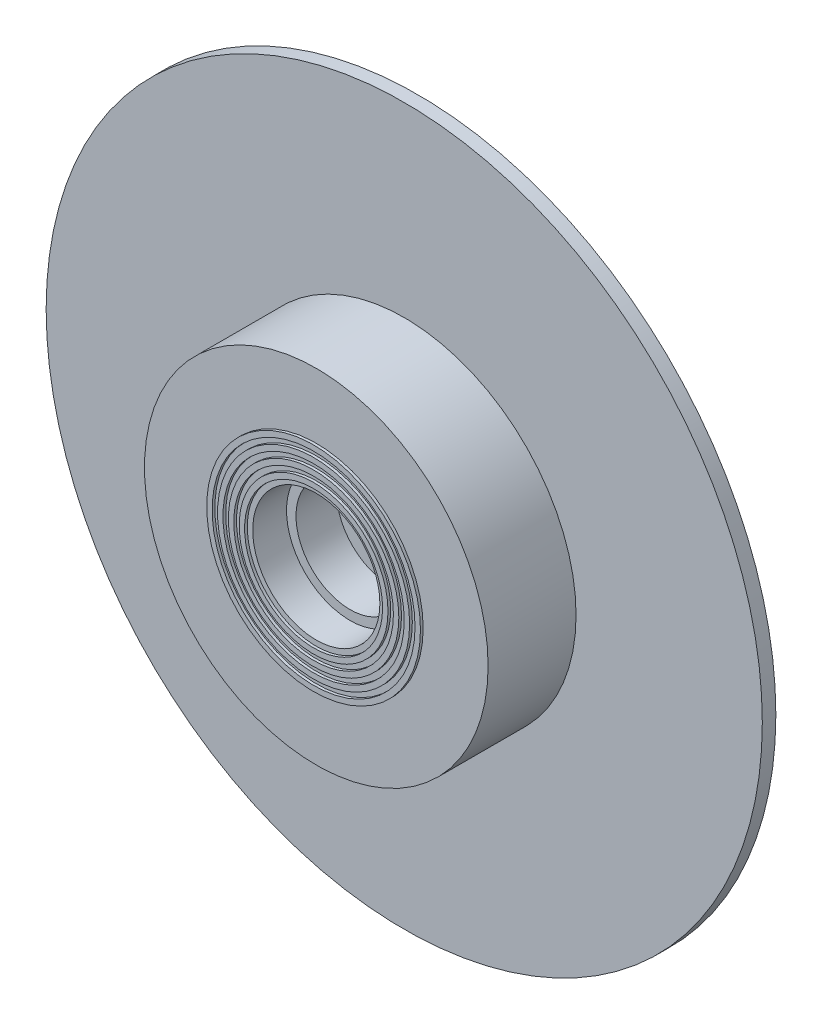
ISO-10303-21;
HEADER;
FILE_DESCRIPTION(('STEP AP214'),'2;1');
FILE_NAME('part.step','',(''),(''),'','','');
FILE_SCHEMA(('AUTOMOTIVE_DESIGN { 1 0 10303 214 1 1 1 1 }'));
ENDSEC;
DATA;
#1=APPLICATION_CONTEXT('core data for automotive mechanical design processes');
#2=APPLICATION_PROTOCOL_DEFINITION('international standard','automotive_design',2000,#1);
#3=PRODUCT_CONTEXT('',#1,'mechanical');
#4=PRODUCT('Part','Part','',(#3));
#5=PRODUCT_RELATED_PRODUCT_CATEGORY('part','',(#4));
#6=PRODUCT_DEFINITION_FORMATION('','',#4);
#7=PRODUCT_DEFINITION_CONTEXT('part definition',#1,'design');
#8=PRODUCT_DEFINITION('design','',#6,#7);
#9=PRODUCT_DEFINITION_SHAPE('','',#8);
#10=(LENGTH_UNIT() NAMED_UNIT(*) SI_UNIT(.MILLI.,.METRE.));
#11=(NAMED_UNIT(*) PLANE_ANGLE_UNIT() SI_UNIT($,.RADIAN.));
#12=(NAMED_UNIT(*) SI_UNIT($,.STERADIAN.) SOLID_ANGLE_UNIT());
#13=UNCERTAINTY_MEASURE_WITH_UNIT(LENGTH_MEASURE(1.E-05),#10,'distance_accuracy_value','');
#14=(GEOMETRIC_REPRESENTATION_CONTEXT(3) GLOBAL_UNCERTAINTY_ASSIGNED_CONTEXT((#13)) GLOBAL_UNIT_ASSIGNED_CONTEXT((#10,
#11,#12)) REPRESENTATION_CONTEXT('',''));
#15=CARTESIAN_POINT('',(0.,0.,0.));
#16=DIRECTION('',(0.,0.,1.));
#17=DIRECTION('',(1.,0.,0.));
#18=AXIS2_PLACEMENT_3D('',#15,#16,#17);
#19=CARTESIAN_POINT('',(0.,0.,1538.3488944663));
#20=DIRECTION('',(0.,0.,1.));
#21=DIRECTION('',(1.,0.,0.));
#22=AXIS2_PLACEMENT_3D('',#19,#20,#21);
#23=CYLINDRICAL_SURFACE('',#22,28.5);
#24=CARTESIAN_POINT('',(0.,0.,4.99999999999989));
#25=DIRECTION('',(0.,0.,1.));
#26=DIRECTION('',(1.,0.,0.));
#27=AXIS2_PLACEMENT_3D('',#24,#25,#26);
#28=CIRCLE('',#27,28.5);
#29=CARTESIAN_POINT('',(28.5,0.,4.99999999999989));
#30=VERTEX_POINT('',#29);
#31=EDGE_CURVE('E10',#30,#30,#28,.T.);
#32=ORIENTED_EDGE('',*,*,#31,.T.);
#33=EDGE_LOOP('',(#32));
#34=FACE_BOUND('',#33,.T.);
#35=CARTESIAN_POINT('',(0.,0.,32.5));
#36=DIRECTION('',(0.,0.,1.));
#37=DIRECTION('',(1.,0.,0.));
#38=AXIS2_PLACEMENT_3D('',#35,#36,#37);
#39=CIRCLE('',#38,28.5);
#40=CARTESIAN_POINT('',(28.5,0.,32.5));
#41=VERTEX_POINT('',#40);
#42=EDGE_CURVE('E134',#41,#41,#39,.T.);
#43=ORIENTED_EDGE('',*,*,#42,.F.);
#44=EDGE_LOOP('',(#43));
#45=FACE_BOUND('',#44,.T.);
#46=ADVANCED_FACE('F40',(#34,#45),#23,.T.);
#47=CARTESIAN_POINT('',(0.,0.,5.));
#48=DIRECTION('',(0.,0.,-1.));
#49=DIRECTION('',(-1.,0.,0.));
#50=AXIS2_PLACEMENT_3D('',#47,#48,#49);
#51=PLANE('',#50);
#52=CARTESIAN_POINT('',(0.,0.,4.99999999999989));
#53=DIRECTION('',(0.,0.,1.));
#54=DIRECTION('',(1.,0.,0.));
#55=AXIS2_PLACEMENT_3D('',#52,#53,#54);
#56=CIRCLE('',#55,12.1);
#57=CARTESIAN_POINT('',(12.1,0.,4.99999999999989));
#58=VERTEX_POINT('',#57);
#59=EDGE_CURVE('E43',#58,#58,#56,.T.);
#60=ORIENTED_EDGE('',*,*,#59,.T.);
#61=EDGE_LOOP('',(#60));
#62=FACE_BOUND('',#61,.T.);
#63=ORIENTED_EDGE('',*,*,#31,.F.);
#64=EDGE_LOOP('',(#63));
#65=FACE_BOUND('',#64,.T.);
#66=ADVANCED_FACE('F138',(#62,#65),#51,.T.);
#67=CARTESIAN_POINT('',(0.,0.,1538.3488944663));
#68=DIRECTION('',(0.,0.,1.));
#69=DIRECTION('',(1.,0.,0.));
#70=AXIS2_PLACEMENT_3D('',#67,#68,#69);
#71=CYLINDRICAL_SURFACE('',#70,12.1);
#72=CARTESIAN_POINT('',(0.,0.,10.));
#73=DIRECTION('',(0.,0.,1.));
#74=DIRECTION('',(1.,0.,0.));
#75=AXIS2_PLACEMENT_3D('',#72,#73,#74);
#76=CIRCLE('',#75,12.1);
#77=CARTESIAN_POINT('',(12.1,0.,10.));
#78=VERTEX_POINT('',#77);
#79=EDGE_CURVE('E50',#78,#78,#76,.T.);
#80=ORIENTED_EDGE('',*,*,#79,.T.);
#81=EDGE_LOOP('',(#80));
#82=FACE_BOUND('',#81,.T.);
#83=ORIENTED_EDGE('',*,*,#59,.F.);
#84=EDGE_LOOP('',(#83));
#85=FACE_BOUND('',#84,.T.);
#86=ADVANCED_FACE('F141',(#82,#85),#71,.F.);
#87=CARTESIAN_POINT('',(0.,0.,10.));
#88=DIRECTION('',(0.,0.,1.));
#89=DIRECTION('',(1.,0.,0.));
#90=AXIS2_PLACEMENT_3D('',#87,#88,#89);
#91=PLANE('',#90);
#92=CARTESIAN_POINT('',(0.,0.,10.));
#93=DIRECTION('',(0.,0.,1.));
#94=DIRECTION('',(1.,0.,0.));
#95=AXIS2_PLACEMENT_3D('',#92,#93,#94);
#96=CIRCLE('',#95,20.);
#97=CARTESIAN_POINT('',(20.,0.,10.));
#98=VERTEX_POINT('',#97);
#99=EDGE_CURVE('E51',#98,#98,#96,.T.);
#100=ORIENTED_EDGE('',*,*,#99,.T.);
#101=EDGE_LOOP('',(#100));
#102=FACE_BOUND('',#101,.T.);
#103=ORIENTED_EDGE('',*,*,#79,.F.);
#104=EDGE_LOOP('',(#103));
#105=FACE_BOUND('',#104,.T.);
#106=ADVANCED_FACE('F150',(#102,#105),#91,.T.);
#107=CARTESIAN_POINT('',(0.,0.,1538.3488944663));
#108=DIRECTION('',(0.,0.,1.));
#109=DIRECTION('',(1.,0.,0.));
#110=AXIS2_PLACEMENT_3D('',#107,#108,#109);
#111=CYLINDRICAL_SURFACE('',#110,20.);
#112=CARTESIAN_POINT('',(0.,0.,24.9999999999999));
#113=DIRECTION('',(0.,0.,1.));
#114=DIRECTION('',(1.,0.,0.));
#115=AXIS2_PLACEMENT_3D('',#112,#113,#114);
#116=CIRCLE('',#115,20.);
#117=CARTESIAN_POINT('',(20.,0.,24.9999999999999));
#118=VERTEX_POINT('',#117);
#119=EDGE_CURVE('E57',#118,#118,#116,.T.);
#120=ORIENTED_EDGE('',*,*,#119,.T.);
#121=EDGE_LOOP('',(#120));
#122=FACE_BOUND('',#121,.T.);
#123=ORIENTED_EDGE('',*,*,#99,.F.);
#124=EDGE_LOOP('',(#123));
#125=FACE_BOUND('',#124,.T.);
#126=ADVANCED_FACE('F152',(#122,#125),#111,.F.);
#127=CARTESIAN_POINT('',(0.,0.,25.));
#128=DIRECTION('',(0.,0.,1.));
#129=DIRECTION('',(1.,0.,0.));
#130=AXIS2_PLACEMENT_3D('',#127,#128,#129);
#131=PLANE('',#130);
#132=CARTESIAN_POINT('',(0.,0.,24.9999999999999));
#133=DIRECTION('',(0.,0.,1.));
#134=DIRECTION('',(1.,0.,0.));
#135=AXIS2_PLACEMENT_3D('',#132,#133,#134);
#136=CIRCLE('',#135,23.5);
#137=CARTESIAN_POINT('',(23.5,0.,24.9999999999999));
#138=VERTEX_POINT('',#137);
#139=EDGE_CURVE('E56',#138,#138,#136,.T.);
#140=ORIENTED_EDGE('',*,*,#139,.T.);
#141=EDGE_LOOP('',(#140));
#142=FACE_BOUND('',#141,.T.);
#143=ORIENTED_EDGE('',*,*,#119,.F.);
#144=EDGE_LOOP('',(#143));
#145=FACE_BOUND('',#144,.T.);
#146=ADVANCED_FACE('F158',(#142,#145),#131,.T.);
#147=CARTESIAN_POINT('',(0.,0.,1538.3488944663));
#148=DIRECTION('',(0.,0.,1.));
#149=DIRECTION('',(1.,0.,0.));
#150=AXIS2_PLACEMENT_3D('',#147,#148,#149);
#151=CYLINDRICAL_SURFACE('',#150,23.5);
#152=CARTESIAN_POINT('',(0.,0.,37.5000000000001));
#153=DIRECTION('',(0.,0.,1.));
#154=DIRECTION('',(1.,0.,0.));
#155=AXIS2_PLACEMENT_3D('',#152,#153,#154);
#156=CIRCLE('',#155,23.5);
#157=CARTESIAN_POINT('',(23.5,0.,37.5000000000001));
#158=VERTEX_POINT('',#157);
#159=EDGE_CURVE('E61',#158,#158,#156,.T.);
#160=ORIENTED_EDGE('',*,*,#159,.T.);
#161=EDGE_LOOP('',(#160));
#162=FACE_BOUND('',#161,.T.);
#163=ORIENTED_EDGE('',*,*,#139,.F.);
#164=EDGE_LOOP('',(#163));
#165=FACE_BOUND('',#164,.T.);
#166=ADVANCED_FACE('F165',(#162,#165),#151,.F.);
#167=CARTESIAN_POINT('',(0.,0.,37.5));
#168=DIRECTION('',(0.,0.,1.));
#169=DIRECTION('',(1.,0.,0.));
#170=AXIS2_PLACEMENT_3D('',#167,#168,#169);
#171=PLANE('',#170);
#172=CARTESIAN_POINT('',(0.,0.,37.5000000000001));
#173=DIRECTION('',(0.,0.,1.));
#174=DIRECTION('',(1.,0.,0.));
#175=AXIS2_PLACEMENT_3D('',#172,#173,#174);
#176=CIRCLE('',#175,25.5);
#177=CARTESIAN_POINT('',(25.5,0.,37.5000000000001));
#178=VERTEX_POINT('',#177);
#179=EDGE_CURVE('E62',#178,#178,#176,.T.);
#180=ORIENTED_EDGE('',*,*,#179,.T.);
#181=EDGE_LOOP('',(#180));
#182=FACE_BOUND('',#181,.T.);
#183=ORIENTED_EDGE('',*,*,#159,.F.);
#184=EDGE_LOOP('',(#183));
#185=FACE_BOUND('',#184,.T.);
#186=ADVANCED_FACE('F167',(#182,#185),#171,.T.);
#187=CARTESIAN_POINT('',(0.,0.,1538.3488944663));
#188=DIRECTION('',(0.,0.,1.));
#189=DIRECTION('',(1.,0.,0.));
#190=AXIS2_PLACEMENT_3D('',#187,#188,#189);
#191=CYLINDRICAL_SURFACE('',#190,25.5);
#192=CARTESIAN_POINT('',(0.,0.,38.5));
#193=DIRECTION('',(0.,0.,1.));
#194=DIRECTION('',(1.,0.,0.));
#195=AXIS2_PLACEMENT_3D('',#192,#193,#194);
#196=CIRCLE('',#195,25.5);
#197=CARTESIAN_POINT('',(25.5,0.,38.5));
#198=VERTEX_POINT('',#197);
#199=EDGE_CURVE('E70',#198,#198,#196,.T.);
#200=ORIENTED_EDGE('',*,*,#199,.T.);
#201=EDGE_LOOP('',(#200));
#202=FACE_BOUND('',#201,.T.);
#203=ORIENTED_EDGE('',*,*,#179,.F.);
#204=EDGE_LOOP('',(#203));
#205=FACE_BOUND('',#204,.T.);
#206=ADVANCED_FACE('F168',(#202,#205),#191,.F.);
#207=CARTESIAN_POINT('',(0.,1.33573707650214E-13,38.5));
#208=DIRECTION('',(0.,0.,1.));
#209=DIRECTION('',(1.,0.,0.));
#210=AXIS2_PLACEMENT_3D('',#207,#208,#209);
#211=PLANE('',#210);
#212=CARTESIAN_POINT('',(0.,0.,38.5));
#213=DIRECTION('',(0.,0.,1.));
#214=DIRECTION('',(1.,0.,0.));
#215=AXIS2_PLACEMENT_3D('',#212,#213,#214);
#216=CIRCLE('',#215,27.5);
#217=CARTESIAN_POINT('',(27.5,0.,38.5));
#218=VERTEX_POINT('',#217);
#219=EDGE_CURVE('E72',#218,#218,#216,.T.);
#220=ORIENTED_EDGE('',*,*,#219,.T.);
#221=EDGE_LOOP('',(#220));
#222=FACE_BOUND('',#221,.T.);
#223=ORIENTED_EDGE('',*,*,#199,.F.);
#224=EDGE_LOOP('',(#223));
#225=FACE_BOUND('',#224,.T.);
#226=ADVANCED_FACE('F173',(#222,#225),#211,.T.);
#227=CARTESIAN_POINT('',(0.,0.,1538.3488944663));
#228=DIRECTION('',(0.,0.,1.));
#229=DIRECTION('',(1.,0.,0.));
#230=AXIS2_PLACEMENT_3D('',#227,#228,#229);
#231=CYLINDRICAL_SURFACE('',#230,27.5);
#232=CARTESIAN_POINT('',(0.,0.,37.5000000000001));
#233=DIRECTION('',(0.,0.,1.));
#234=DIRECTION('',(1.,0.,0.));
#235=AXIS2_PLACEMENT_3D('',#232,#233,#234);
#236=CIRCLE('',#235,27.5);
#237=CARTESIAN_POINT('',(27.5,0.,37.5000000000001));
#238=VERTEX_POINT('',#237);
#239=EDGE_CURVE('E74',#238,#238,#236,.T.);
#240=ORIENTED_EDGE('',*,*,#239,.T.);
#241=EDGE_LOOP('',(#240));
#242=FACE_BOUND('',#241,.T.);
#243=ORIENTED_EDGE('',*,*,#219,.F.);
#244=EDGE_LOOP('',(#243));
#245=FACE_BOUND('',#244,.T.);
#246=ADVANCED_FACE('F180',(#242,#245),#231,.T.);
#247=CARTESIAN_POINT('',(0.,0.,37.5));
#248=DIRECTION('',(0.,0.,1.));
#249=DIRECTION('',(1.,0.,0.));
#250=AXIS2_PLACEMENT_3D('',#247,#248,#249);
#251=PLANE('',#250);
#252=CARTESIAN_POINT('',(0.,0.,37.5000000000001));
#253=DIRECTION('',(0.,0.,1.));
#254=DIRECTION('',(1.,0.,0.));
#255=AXIS2_PLACEMENT_3D('',#252,#253,#254);
#256=CIRCLE('',#255,29.5);
#257=CARTESIAN_POINT('',(29.5,0.,37.5000000000001));
#258=VERTEX_POINT('',#257);
#259=EDGE_CURVE('E76',#258,#258,#256,.T.);
#260=ORIENTED_EDGE('',*,*,#259,.T.);
#261=EDGE_LOOP('',(#260));
#262=FACE_BOUND('',#261,.T.);
#263=ORIENTED_EDGE('',*,*,#239,.F.);
#264=EDGE_LOOP('',(#263));
#265=FACE_BOUND('',#264,.T.);
#266=ADVANCED_FACE('F185',(#262,#265),#251,.T.);
#267=CARTESIAN_POINT('',(0.,0.,1538.3488944663));
#268=DIRECTION('',(0.,0.,1.));
#269=DIRECTION('',(1.,0.,0.));
#270=AXIS2_PLACEMENT_3D('',#267,#268,#269);
#271=CYLINDRICAL_SURFACE('',#270,29.5);
#272=CARTESIAN_POINT('',(0.,0.,38.5));
#273=DIRECTION('',(0.,0.,1.));
#274=DIRECTION('',(1.,0.,0.));
#275=AXIS2_PLACEMENT_3D('',#272,#273,#274);
#276=CIRCLE('',#275,29.5);
#277=CARTESIAN_POINT('',(29.5,0.,38.5));
#278=VERTEX_POINT('',#277);
#279=EDGE_CURVE('E77',#278,#278,#276,.T.);
#280=ORIENTED_EDGE('',*,*,#279,.T.);
#281=EDGE_LOOP('',(#280));
#282=FACE_BOUND('',#281,.T.);
#283=ORIENTED_EDGE('',*,*,#259,.F.);
#284=EDGE_LOOP('',(#283));
#285=FACE_BOUND('',#284,.T.);
#286=ADVANCED_FACE('F189',(#282,#285),#271,.F.);
#287=CARTESIAN_POINT('',(0.,1.33573707650214E-13,38.5));
#288=DIRECTION('',(0.,0.,1.));
#289=DIRECTION('',(1.,0.,0.));
#290=AXIS2_PLACEMENT_3D('',#287,#288,#289);
#291=PLANE('',#290);
#292=CARTESIAN_POINT('',(0.,0.,38.5));
#293=DIRECTION('',(0.,0.,1.));
#294=DIRECTION('',(1.,0.,0.));
#295=AXIS2_PLACEMENT_3D('',#292,#293,#294);
#296=CIRCLE('',#295,31.5);
#297=CARTESIAN_POINT('',(31.5,0.,38.5));
#298=VERTEX_POINT('',#297);
#299=EDGE_CURVE('E85',#298,#298,#296,.T.);
#300=ORIENTED_EDGE('',*,*,#299,.T.);
#301=EDGE_LOOP('',(#300));
#302=FACE_BOUND('',#301,.T.);
#303=ORIENTED_EDGE('',*,*,#279,.F.);
#304=EDGE_LOOP('',(#303));
#305=FACE_BOUND('',#304,.T.);
#306=ADVANCED_FACE('F187',(#302,#305),#291,.T.);
#307=CARTESIAN_POINT('',(0.,0.,1538.3488944663));
#308=DIRECTION('',(0.,0.,1.));
#309=DIRECTION('',(1.,0.,0.));
#310=AXIS2_PLACEMENT_3D('',#307,#308,#309);
#311=CYLINDRICAL_SURFACE('',#310,31.5);
#312=CARTESIAN_POINT('',(0.,0.,37.5000000000001));
#313=DIRECTION('',(0.,0.,1.));
#314=DIRECTION('',(1.,0.,0.));
#315=AXIS2_PLACEMENT_3D('',#312,#313,#314);
#316=CIRCLE('',#315,31.5);
#317=CARTESIAN_POINT('',(31.5,0.,37.5000000000001));
#318=VERTEX_POINT('',#317);
#319=EDGE_CURVE('E88',#318,#318,#316,.T.);
#320=ORIENTED_EDGE('',*,*,#319,.T.);
#321=EDGE_LOOP('',(#320));
#322=FACE_BOUND('',#321,.T.);
#323=ORIENTED_EDGE('',*,*,#299,.F.);
#324=EDGE_LOOP('',(#323));
#325=FACE_BOUND('',#324,.T.);
#326=ADVANCED_FACE('F193',(#322,#325),#311,.T.);
#327=CARTESIAN_POINT('',(0.,0.,37.5));
#328=DIRECTION('',(0.,0.,1.));
#329=DIRECTION('',(1.,0.,0.));
#330=AXIS2_PLACEMENT_3D('',#327,#328,#329);
#331=PLANE('',#330);
#332=CARTESIAN_POINT('',(0.,0.,37.5000000000001));
#333=DIRECTION('',(0.,0.,1.));
#334=DIRECTION('',(1.,0.,0.));
#335=AXIS2_PLACEMENT_3D('',#332,#333,#334);
#336=CIRCLE('',#335,33.5);
#337=CARTESIAN_POINT('',(33.5,0.,37.5000000000001));
#338=VERTEX_POINT('',#337);
#339=EDGE_CURVE('E90',#338,#338,#336,.T.);
#340=ORIENTED_EDGE('',*,*,#339,.T.);
#341=EDGE_LOOP('',(#340));
#342=FACE_BOUND('',#341,.T.);
#343=ORIENTED_EDGE('',*,*,#319,.F.);
#344=EDGE_LOOP('',(#343));
#345=FACE_BOUND('',#344,.T.);
#346=ADVANCED_FACE('F196',(#342,#345),#331,.T.);
#347=CARTESIAN_POINT('',(0.,0.,1538.3488944663));
#348=DIRECTION('',(0.,0.,1.));
#349=DIRECTION('',(1.,0.,0.));
#350=AXIS2_PLACEMENT_3D('',#347,#348,#349);
#351=CYLINDRICAL_SURFACE('',#350,33.5);
#352=CARTESIAN_POINT('',(0.,0.,38.5));
#353=DIRECTION('',(0.,0.,1.));
#354=DIRECTION('',(1.,0.,0.));
#355=AXIS2_PLACEMENT_3D('',#352,#353,#354);
#356=CIRCLE('',#355,33.5);
#357=CARTESIAN_POINT('',(33.5,0.,38.5));
#358=VERTEX_POINT('',#357);
#359=EDGE_CURVE('E95',#358,#358,#356,.T.);
#360=ORIENTED_EDGE('',*,*,#359,.T.);
#361=EDGE_LOOP('',(#360));
#362=FACE_BOUND('',#361,.T.);
#363=ORIENTED_EDGE('',*,*,#339,.F.);
#364=EDGE_LOOP('',(#363));
#365=FACE_BOUND('',#364,.T.);
#366=ADVANCED_FACE('F205',(#362,#365),#351,.F.);
#367=CARTESIAN_POINT('',(0.,1.33573707650214E-13,38.5));
#368=DIRECTION('',(0.,0.,1.));
#369=DIRECTION('',(1.,0.,0.));
#370=AXIS2_PLACEMENT_3D('',#367,#368,#369);
#371=PLANE('',#370);
#372=CARTESIAN_POINT('',(0.,0.,38.5));
#373=DIRECTION('',(0.,0.,1.));
#374=DIRECTION('',(1.,0.,0.));
#375=AXIS2_PLACEMENT_3D('',#372,#373,#374);
#376=CIRCLE('',#375,35.5);
#377=CARTESIAN_POINT('',(35.5,0.,38.5));
#378=VERTEX_POINT('',#377);
#379=EDGE_CURVE('E92',#378,#378,#376,.T.);
#380=ORIENTED_EDGE('',*,*,#379,.T.);
#381=EDGE_LOOP('',(#380));
#382=FACE_BOUND('',#381,.T.);
#383=ORIENTED_EDGE('',*,*,#359,.F.);
#384=EDGE_LOOP('',(#383));
#385=FACE_BOUND('',#384,.T.);
#386=ADVANCED_FACE('F206',(#382,#385),#371,.T.);
#387=CARTESIAN_POINT('',(0.,0.,1538.3488944663));
#388=DIRECTION('',(0.,0.,1.));
#389=DIRECTION('',(1.,0.,0.));
#390=AXIS2_PLACEMENT_3D('',#387,#388,#389);
#391=CYLINDRICAL_SURFACE('',#390,35.5);
#392=CARTESIAN_POINT('',(0.,0.,37.5000000000001));
#393=DIRECTION('',(0.,0.,1.));
#394=DIRECTION('',(1.,0.,0.));
#395=AXIS2_PLACEMENT_3D('',#392,#393,#394);
#396=CIRCLE('',#395,35.5);
#397=CARTESIAN_POINT('',(35.5,0.,37.5000000000001));
#398=VERTEX_POINT('',#397);
#399=EDGE_CURVE('E98',#398,#398,#396,.T.);
#400=ORIENTED_EDGE('',*,*,#399,.T.);
#401=EDGE_LOOP('',(#400));
#402=FACE_BOUND('',#401,.T.);
#403=ORIENTED_EDGE('',*,*,#379,.F.);
#404=EDGE_LOOP('',(#403));
#405=FACE_BOUND('',#404,.T.);
#406=ADVANCED_FACE('F209',(#402,#405),#391,.T.);
#407=CARTESIAN_POINT('',(0.,1.3010426069826E-13,37.5));
#408=DIRECTION('',(0.,0.,1.));
#409=DIRECTION('',(1.,0.,0.));
#410=AXIS2_PLACEMENT_3D('',#407,#408,#409);
#411=PLANE('',#410);
#412=CARTESIAN_POINT('',(0.,0.,37.5000000000001));
#413=DIRECTION('',(0.,0.,1.));
#414=DIRECTION('',(1.,0.,0.));
#415=AXIS2_PLACEMENT_3D('',#412,#413,#414);
#416=CIRCLE('',#415,37.5);
#417=CARTESIAN_POINT('',(37.5,0.,37.5000000000001));
#418=VERTEX_POINT('',#417);
#419=EDGE_CURVE('E101',#418,#418,#416,.T.);
#420=ORIENTED_EDGE('',*,*,#419,.T.);
#421=EDGE_LOOP('',(#420));
#422=FACE_BOUND('',#421,.T.);
#423=ORIENTED_EDGE('',*,*,#399,.F.);
#424=EDGE_LOOP('',(#423));
#425=FACE_BOUND('',#424,.T.);
#426=ADVANCED_FACE('F212',(#422,#425),#411,.T.);
#427=CARTESIAN_POINT('',(0.,0.,1538.3488944663));
#428=DIRECTION('',(0.,0.,1.));
#429=DIRECTION('',(1.,0.,0.));
#430=AXIS2_PLACEMENT_3D('',#427,#428,#429);
#431=CYLINDRICAL_SURFACE('',#430,37.5);
#432=CARTESIAN_POINT('',(0.,0.,38.5));
#433=DIRECTION('',(0.,0.,1.));
#434=DIRECTION('',(1.,0.,0.));
#435=AXIS2_PLACEMENT_3D('',#432,#433,#434);
#436=CIRCLE('',#435,37.5);
#437=CARTESIAN_POINT('',(37.5,0.,38.5));
#438=VERTEX_POINT('',#437);
#439=EDGE_CURVE('E102',#438,#438,#436,.T.);
#440=ORIENTED_EDGE('',*,*,#439,.T.);
#441=EDGE_LOOP('',(#440));
#442=FACE_BOUND('',#441,.T.);
#443=ORIENTED_EDGE('',*,*,#419,.F.);
#444=EDGE_LOOP('',(#443));
#445=FACE_BOUND('',#444,.T.);
#446=ADVANCED_FACE('F217',(#442,#445),#431,.F.);
#447=CARTESIAN_POINT('',(0.,1.33573707650214E-13,38.5));
#448=DIRECTION('',(0.,0.,1.));
#449=DIRECTION('',(1.,0.,0.));
#450=AXIS2_PLACEMENT_3D('',#447,#448,#449);
#451=PLANE('',#450);
#452=CARTESIAN_POINT('',(0.,0.,38.5));
#453=DIRECTION('',(0.,0.,1.));
#454=DIRECTION('',(1.,0.,0.));
#455=AXIS2_PLACEMENT_3D('',#452,#453,#454);
#456=CIRCLE('',#455,39.5);
#457=CARTESIAN_POINT('',(39.5,0.,38.5));
#458=VERTEX_POINT('',#457);
#459=EDGE_CURVE('E110',#458,#458,#456,.T.);
#460=ORIENTED_EDGE('',*,*,#459,.T.);
#461=EDGE_LOOP('',(#460));
#462=FACE_BOUND('',#461,.T.);
#463=ORIENTED_EDGE('',*,*,#439,.F.);
#464=EDGE_LOOP('',(#463));
#465=FACE_BOUND('',#464,.T.);
#466=ADVANCED_FACE('F225',(#462,#465),#451,.T.);
#467=CARTESIAN_POINT('',(0.,0.,1538.3488944663));
#468=DIRECTION('',(0.,0.,1.));
#469=DIRECTION('',(1.,0.,0.));
#470=AXIS2_PLACEMENT_3D('',#467,#468,#469);
#471=CYLINDRICAL_SURFACE('',#470,39.5);
#472=CARTESIAN_POINT('',(0.,0.,37.5000000000001));
#473=DIRECTION('',(0.,0.,1.));
#474=DIRECTION('',(1.,0.,0.));
#475=AXIS2_PLACEMENT_3D('',#472,#473,#474);
#476=CIRCLE('',#475,39.5);
#477=CARTESIAN_POINT('',(39.5,0.,37.5000000000001));
#478=VERTEX_POINT('',#477);
#479=EDGE_CURVE('E109',#478,#478,#476,.T.);
#480=ORIENTED_EDGE('',*,*,#479,.T.);
#481=EDGE_LOOP('',(#480));
#482=FACE_BOUND('',#481,.T.);
#483=ORIENTED_EDGE('',*,*,#459,.F.);
#484=EDGE_LOOP('',(#483));
#485=FACE_BOUND('',#484,.T.);
#486=ADVANCED_FACE('F229',(#482,#485),#471,.T.);
#487=CARTESIAN_POINT('',(0.,0.,37.5));
#488=DIRECTION('',(0.,0.,1.));
#489=DIRECTION('',(1.,0.,0.));
#490=AXIS2_PLACEMENT_3D('',#487,#488,#489);
#491=PLANE('',#490);
#492=CARTESIAN_POINT('',(0.,0.,37.5000000000001));
#493=DIRECTION('',(0.,0.,1.));
#494=DIRECTION('',(1.,0.,0.));
#495=AXIS2_PLACEMENT_3D('',#492,#493,#494);
#496=CIRCLE('',#495,63.5);
#497=CARTESIAN_POINT('',(63.5,0.,37.5000000000001));
#498=VERTEX_POINT('',#497);
#499=EDGE_CURVE('E114',#498,#498,#496,.T.);
#500=ORIENTED_EDGE('',*,*,#499,.T.);
#501=EDGE_LOOP('',(#500));
#502=FACE_BOUND('',#501,.T.);
#503=ORIENTED_EDGE('',*,*,#479,.F.);
#504=EDGE_LOOP('',(#503));
#505=FACE_BOUND('',#504,.T.);
#506=ADVANCED_FACE('F227',(#502,#505),#491,.T.);
#507=CARTESIAN_POINT('',(0.,0.,1538.3488944663));
#508=DIRECTION('',(0.,0.,1.));
#509=DIRECTION('',(1.,0.,0.));
#510=AXIS2_PLACEMENT_3D('',#507,#508,#509);
#511=CYLINDRICAL_SURFACE('',#510,63.4999999999999);
#512=CARTESIAN_POINT('',(0.,0.,4.99999999999989));
#513=DIRECTION('',(0.,0.,1.));
#514=DIRECTION('',(1.,0.,0.));
#515=AXIS2_PLACEMENT_3D('',#512,#513,#514);
#516=CIRCLE('',#515,63.4999999999999);
#517=CARTESIAN_POINT('',(63.4999999999999,0.,4.99999999999989));
#518=VERTEX_POINT('',#517);
#519=EDGE_CURVE('E119',#518,#518,#516,.T.);
#520=ORIENTED_EDGE('',*,*,#519,.T.);
#521=EDGE_LOOP('',(#520));
#522=FACE_BOUND('',#521,.T.);
#523=ORIENTED_EDGE('',*,*,#499,.F.);
#524=EDGE_LOOP('',(#523));
#525=FACE_BOUND('',#524,.T.);
#526=ADVANCED_FACE('F233',(#522,#525),#511,.T.);
#527=CARTESIAN_POINT('',(0.,0.,5.));
#528=DIRECTION('',(0.,0.,-1.));
#529=DIRECTION('',(-1.,0.,0.));
#530=AXIS2_PLACEMENT_3D('',#527,#528,#529);
#531=PLANE('',#530);
#532=ORIENTED_EDGE('',*,*,#519,.F.);
#533=EDGE_LOOP('',(#532));
#534=FACE_BOUND('',#533,.T.);
#535=CARTESIAN_POINT('',(0.,0.,4.99999999999989));
#536=DIRECTION('',(0.,0.,1.));
#537=DIRECTION('',(1.,0.,0.));
#538=AXIS2_PLACEMENT_3D('',#535,#536,#537);
#539=CIRCLE('',#538,132.334);
#540=CARTESIAN_POINT('',(132.334,0.,4.99999999999989));
#541=VERTEX_POINT('',#540);
#542=EDGE_CURVE('E118',#541,#541,#539,.T.);
#543=ORIENTED_EDGE('',*,*,#542,.T.);
#544=EDGE_LOOP('',(#543));
#545=FACE_BOUND('',#544,.T.);
#546=ADVANCED_FACE('F236',(#534,#545),#531,.F.);
#547=CARTESIAN_POINT('',(0.,0.,1538.3488944663));
#548=DIRECTION('',(0.,0.,1.));
#549=DIRECTION('',(1.,0.,0.));
#550=AXIS2_PLACEMENT_3D('',#547,#548,#549);
#551=CYLINDRICAL_SURFACE('',#550,132.334);
#552=ORIENTED_EDGE('',*,*,#542,.F.);
#553=EDGE_LOOP('',(#552));
#554=FACE_BOUND('',#553,.T.);
#555=CARTESIAN_POINT('',(0.,0.,0.));
#556=DIRECTION('',(0.,0.,1.));
#557=DIRECTION('',(1.,0.,0.));
#558=AXIS2_PLACEMENT_3D('',#555,#556,#557);
#559=CIRCLE('',#558,132.334);
#560=CARTESIAN_POINT('',(132.334,0.,0.));
#561=VERTEX_POINT('',#560);
#562=EDGE_CURVE('E121',#561,#561,#559,.T.);
#563=ORIENTED_EDGE('',*,*,#562,.T.);
#564=EDGE_LOOP('',(#563));
#565=FACE_BOUND('',#564,.T.);
#566=ADVANCED_FACE('F241',(#554,#565),#551,.T.);
#567=CARTESIAN_POINT('',(0.,0.,0.));
#568=DIRECTION('',(0.,0.,-1.));
#569=DIRECTION('',(-1.,0.,0.));
#570=AXIS2_PLACEMENT_3D('',#567,#568,#569);
#571=PLANE('',#570);
#572=CARTESIAN_POINT('',(0.,0.,0.));
#573=DIRECTION('',(0.,0.,1.));
#574=DIRECTION('',(1.,0.,0.));
#575=AXIS2_PLACEMENT_3D('',#572,#573,#574);
#576=CIRCLE('',#575,60.5);
#577=CARTESIAN_POINT('',(60.5,0.,0.));
#578=VERTEX_POINT('',#577);
#579=EDGE_CURVE('E122',#578,#578,#576,.T.);
#580=ORIENTED_EDGE('',*,*,#579,.T.);
#581=EDGE_LOOP('',(#580));
#582=FACE_BOUND('',#581,.T.);
#583=ORIENTED_EDGE('',*,*,#562,.F.);
#584=EDGE_LOOP('',(#583));
#585=FACE_BOUND('',#584,.T.);
#586=ADVANCED_FACE('F249',(#582,#585),#571,.T.);
#587=CARTESIAN_POINT('',(0.,0.,1538.3488944663));
#588=DIRECTION('',(0.,0.,1.));
#589=DIRECTION('',(1.,0.,0.));
#590=AXIS2_PLACEMENT_3D('',#587,#588,#589);
#591=CYLINDRICAL_SURFACE('',#590,60.5);
#592=CARTESIAN_POINT('',(0.,0.,32.5));
#593=DIRECTION('',(0.,0.,1.));
#594=DIRECTION('',(1.,0.,0.));
#595=AXIS2_PLACEMENT_3D('',#592,#593,#594);
#596=CIRCLE('',#595,60.5);
#597=CARTESIAN_POINT('',(60.5,0.,32.5));
#598=VERTEX_POINT('',#597);
#599=EDGE_CURVE('E126',#598,#598,#596,.T.);
#600=ORIENTED_EDGE('',*,*,#599,.T.);
#601=EDGE_LOOP('',(#600));
#602=FACE_BOUND('',#601,.T.);
#603=ORIENTED_EDGE('',*,*,#579,.F.);
#604=EDGE_LOOP('',(#603));
#605=FACE_BOUND('',#604,.T.);
#606=ADVANCED_FACE('F247',(#602,#605),#591,.F.);
#607=CARTESIAN_POINT('',(0.,0.,32.5));
#608=DIRECTION('',(0.,0.,-1.));
#609=DIRECTION('',(-1.,0.,0.));
#610=AXIS2_PLACEMENT_3D('',#607,#608,#609);
#611=PLANE('',#610);
#612=ORIENTED_EDGE('',*,*,#42,.T.);
#613=EDGE_LOOP('',(#612));
#614=FACE_BOUND('',#613,.T.);
#615=ORIENTED_EDGE('',*,*,#599,.F.);
#616=EDGE_LOOP('',(#615));
#617=FACE_BOUND('',#616,.T.);
#618=ADVANCED_FACE('F132',(#614,#617),#611,.T.);
#619=CLOSED_SHELL('',(#46,#66,#86,#106,#126,#146,#166,#186,#206,#226,#246,#266,#286,#306,#326,
#346,#366,#386,#406,#426,#446,#466,#486,#506,#526,#546,#566,#586,#606,#618));
#620=MANIFOLD_SOLID_BREP('B2',#619);
#621=ADVANCED_BREP_SHAPE_REPRESENTATION('',(#18,#620),#14);
#622=SHAPE_DEFINITION_REPRESENTATION(#9,#621);
ENDSEC;
END-ISO-10303-21;
